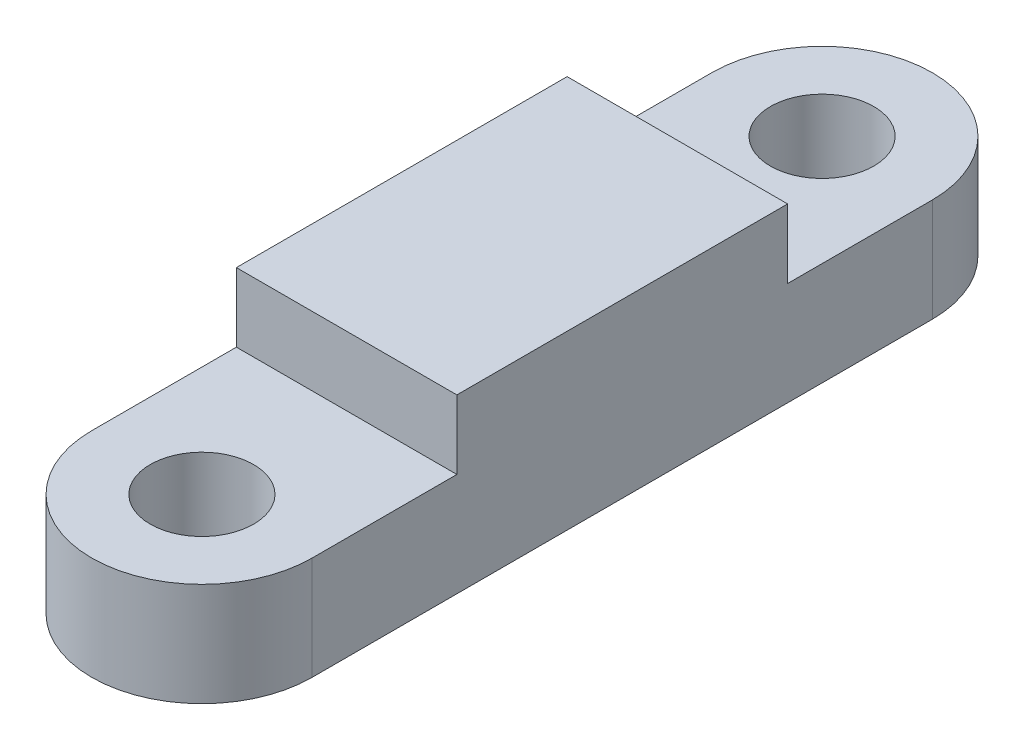
ISO-10303-21;
HEADER;
FILE_DESCRIPTION(('STEP AP214'),'2;1');
FILE_NAME('part.step','',(''),(''),'','','');
FILE_SCHEMA(('AUTOMOTIVE_DESIGN { 1 0 10303 214 1 1 1 1 }'));
ENDSEC;
DATA;
#1=APPLICATION_CONTEXT('core data for automotive mechanical design processes');
#2=APPLICATION_PROTOCOL_DEFINITION('international standard','automotive_design',2000,#1);
#3=PRODUCT_CONTEXT('',#1,'mechanical');
#4=PRODUCT('Part','Part','',(#3));
#5=PRODUCT_RELATED_PRODUCT_CATEGORY('part','',(#4));
#6=PRODUCT_DEFINITION_FORMATION('','',#4);
#7=PRODUCT_DEFINITION_CONTEXT('part definition',#1,'design');
#8=PRODUCT_DEFINITION('design','',#6,#7);
#9=PRODUCT_DEFINITION_SHAPE('','',#8);
#10=(LENGTH_UNIT() NAMED_UNIT(*) SI_UNIT(.MILLI.,.METRE.));
#11=(NAMED_UNIT(*) PLANE_ANGLE_UNIT() SI_UNIT($,.RADIAN.));
#12=(NAMED_UNIT(*) SI_UNIT($,.STERADIAN.) SOLID_ANGLE_UNIT());
#13=UNCERTAINTY_MEASURE_WITH_UNIT(LENGTH_MEASURE(1.E-05),#10,'distance_accuracy_value','');
#14=(GEOMETRIC_REPRESENTATION_CONTEXT(3) GLOBAL_UNCERTAINTY_ASSIGNED_CONTEXT((#13)) GLOBAL_UNIT_ASSIGNED_CONTEXT((#10,
#11,#12)) REPRESENTATION_CONTEXT('',''));
#15=CARTESIAN_POINT('',(0.,0.,0.));
#16=DIRECTION('',(0.,0.,1.));
#17=DIRECTION('',(1.,0.,0.));
#18=AXIS2_PLACEMENT_3D('',#15,#16,#17);
#19=CARTESIAN_POINT('',(0.,1.5,-9.));
#20=DIRECTION('',(0.,1.,0.));
#21=DIRECTION('',(0.,0.,1.));
#22=AXIS2_PLACEMENT_3D('',#19,#20,#21);
#23=PLANE('',#22);
#24=DIRECTION('',(-1.,0.,0.));
#25=VECTOR('',#24,1.);
#26=CARTESIAN_POINT('',(-1.6,1.5,-6.9));
#27=LINE('',#26,#25);
#28=CARTESIAN_POINT('',(1.6,1.5,-6.9));
#29=VERTEX_POINT('',#28);
#30=CARTESIAN_POINT('',(-1.6,1.5,-6.9));
#31=VERTEX_POINT('',#30);
#32=EDGE_CURVE('E50',#29,#31,#27,.T.);
#33=ORIENTED_EDGE('',*,*,#32,.F.);
#34=DIRECTION('',(0.,0.,-1.));
#35=VECTOR('',#34,1.);
#36=CARTESIAN_POINT('',(1.6,1.5,-9.));
#37=LINE('',#36,#35);
#38=CARTESIAN_POINT('',(1.6,1.5,-9.));
#39=VERTEX_POINT('',#38);
#40=EDGE_CURVE('E185',#29,#39,#37,.T.);
#41=ORIENTED_EDGE('',*,*,#40,.T.);
#42=CARTESIAN_POINT('',(0.,1.5,-9.));
#43=DIRECTION('',(0.,1.,0.));
#44=DIRECTION('',(0.,0.,1.));
#45=AXIS2_PLACEMENT_3D('',#42,#43,#44);
#46=CIRCLE('',#45,1.6);
#47=CARTESIAN_POINT('',(-1.6,1.5,-9.));
#48=VERTEX_POINT('',#47);
#49=EDGE_CURVE('E153',#39,#48,#46,.T.);
#50=ORIENTED_EDGE('',*,*,#49,.T.);
#51=DIRECTION('',(0.,0.,1.));
#52=VECTOR('',#51,1.);
#53=CARTESIAN_POINT('',(-1.6,1.5,-9.));
#54=LINE('',#53,#52);
#55=EDGE_CURVE('E165',#48,#31,#54,.T.);
#56=ORIENTED_EDGE('',*,*,#55,.T.);
#57=EDGE_LOOP('',(#33,#41,#50,#56));
#58=FACE_BOUND('',#57,.T.);
#59=CARTESIAN_POINT('',(0.,1.5,-9.));
#60=DIRECTION('',(0.,1.,0.));
#61=DIRECTION('',(0.,0.,1.));
#62=AXIS2_PLACEMENT_3D('',#59,#60,#61);
#63=CIRCLE('',#62,0.750000000000002);
#64=CARTESIAN_POINT('',(0.,1.5,-8.25));
#65=VERTEX_POINT('',#64);
#66=EDGE_CURVE('E147',#65,#65,#63,.T.);
#67=ORIENTED_EDGE('',*,*,#66,.F.);
#68=EDGE_LOOP('',(#67));
#69=FACE_BOUND('',#68,.T.);
#70=ADVANCED_FACE('F33',(#58,#69),#23,.T.);
#71=DIRECTION('',(1.,0.,0.));
#72=VECTOR('',#71,1.);
#73=CARTESIAN_POINT('',(-1.6,1.5,-2.1));
#74=LINE('',#73,#72);
#75=CARTESIAN_POINT('',(-1.6,1.5,-2.1));
#76=VERTEX_POINT('',#75);
#77=CARTESIAN_POINT('',(1.6,1.5,-2.1));
#78=VERTEX_POINT('',#77);
#79=EDGE_CURVE('E58',#76,#78,#74,.T.);
#80=ORIENTED_EDGE('',*,*,#79,.F.);
#81=CARTESIAN_POINT('',(-1.6,1.5,0.));
#82=VERTEX_POINT('',#81);
#83=EDGE_CURVE('E122',#76,#82,#54,.T.);
#84=ORIENTED_EDGE('',*,*,#83,.T.);
#85=CARTESIAN_POINT('',(0.,1.5,0.));
#86=DIRECTION('',(0.,1.,0.));
#87=DIRECTION('',(0.,0.,1.));
#88=AXIS2_PLACEMENT_3D('',#85,#86,#87);
#89=CIRCLE('',#88,1.6);
#90=CARTESIAN_POINT('',(1.6,1.5,0.));
#91=VERTEX_POINT('',#90);
#92=EDGE_CURVE('E159',#82,#91,#89,.T.);
#93=ORIENTED_EDGE('',*,*,#92,.T.);
#94=EDGE_CURVE('E175',#91,#78,#37,.T.);
#95=ORIENTED_EDGE('',*,*,#94,.T.);
#96=EDGE_LOOP('',(#80,#84,#93,#95));
#97=FACE_BOUND('',#96,.T.);
#98=CARTESIAN_POINT('',(0.,1.5,0.));
#99=DIRECTION('',(0.,1.,0.));
#100=DIRECTION('',(0.,0.,1.));
#101=AXIS2_PLACEMENT_3D('',#98,#99,#100);
#102=CIRCLE('',#101,0.750000000000002);
#103=CARTESIAN_POINT('',(0.,1.5,0.750000000000002));
#104=VERTEX_POINT('',#103);
#105=EDGE_CURVE('E126',#104,#104,#102,.T.);
#106=ORIENTED_EDGE('',*,*,#105,.F.);
#107=EDGE_LOOP('',(#106));
#108=FACE_BOUND('',#107,.T.);
#109=ADVANCED_FACE('F191',(#97,#108),#23,.T.);
#110=CARTESIAN_POINT('',(0.,0.,-9.));
#111=DIRECTION('',(0.,1.,0.));
#112=DIRECTION('',(0.,0.,1.));
#113=AXIS2_PLACEMENT_3D('',#110,#111,#112);
#114=PLANE('',#113);
#115=CARTESIAN_POINT('',(0.,0.,-9.));
#116=DIRECTION('',(0.,1.,0.));
#117=DIRECTION('',(0.,0.,1.));
#118=AXIS2_PLACEMENT_3D('',#115,#116,#117);
#119=CIRCLE('',#118,0.750000000000002);
#120=CARTESIAN_POINT('',(0.,0.,-8.25));
#121=VERTEX_POINT('',#120);
#122=EDGE_CURVE('E145',#121,#121,#119,.T.);
#123=ORIENTED_EDGE('',*,*,#122,.T.);
#124=EDGE_LOOP('',(#123));
#125=FACE_BOUND('',#124,.T.);
#126=CARTESIAN_POINT('',(0.,0.,-9.));
#127=DIRECTION('',(0.,1.,0.));
#128=DIRECTION('',(0.,0.,1.));
#129=AXIS2_PLACEMENT_3D('',#126,#127,#128);
#130=CIRCLE('',#129,1.6);
#131=CARTESIAN_POINT('',(1.6,0.,-9.));
#132=VERTEX_POINT('',#131);
#133=CARTESIAN_POINT('',(-1.6,0.,-9.));
#134=VERTEX_POINT('',#133);
#135=EDGE_CURVE('E150',#132,#134,#130,.T.);
#136=ORIENTED_EDGE('',*,*,#135,.F.);
#137=DIRECTION('',(0.,0.,-1.));
#138=VECTOR('',#137,1.);
#139=CARTESIAN_POINT('',(1.6,0.,-9.));
#140=LINE('',#139,#138);
#141=CARTESIAN_POINT('',(1.6,0.,0.));
#142=VERTEX_POINT('',#141);
#143=EDGE_CURVE('E156',#142,#132,#140,.T.);
#144=ORIENTED_EDGE('',*,*,#143,.F.);
#145=CARTESIAN_POINT('',(0.,0.,0.));
#146=DIRECTION('',(0.,1.,0.));
#147=DIRECTION('',(0.,0.,1.));
#148=AXIS2_PLACEMENT_3D('',#145,#146,#147);
#149=CIRCLE('',#148,1.6);
#150=CARTESIAN_POINT('',(-1.6,0.,0.));
#151=VERTEX_POINT('',#150);
#152=EDGE_CURVE('E177',#151,#142,#149,.T.);
#153=ORIENTED_EDGE('',*,*,#152,.F.);
#154=DIRECTION('',(0.,0.,1.));
#155=VECTOR('',#154,1.);
#156=CARTESIAN_POINT('',(-1.6,0.,-9.));
#157=LINE('',#156,#155);
#158=EDGE_CURVE('E179',#134,#151,#157,.T.);
#159=ORIENTED_EDGE('',*,*,#158,.F.);
#160=EDGE_LOOP('',(#136,#144,#153,#159));
#161=FACE_BOUND('',#160,.T.);
#162=CARTESIAN_POINT('',(0.,0.,0.));
#163=DIRECTION('',(0.,1.,0.));
#164=DIRECTION('',(0.,0.,1.));
#165=AXIS2_PLACEMENT_3D('',#162,#163,#164);
#166=CIRCLE('',#165,0.750000000000002);
#167=CARTESIAN_POINT('',(0.,0.,0.750000000000002));
#168=VERTEX_POINT('',#167);
#169=EDGE_CURVE('E123',#168,#168,#166,.T.);
#170=ORIENTED_EDGE('',*,*,#169,.T.);
#171=EDGE_LOOP('',(#170));
#172=FACE_BOUND('',#171,.T.);
#173=ADVANCED_FACE('F219',(#125,#161,#172),#114,.F.);
#174=CARTESIAN_POINT('',(0.,1.5,-9.));
#175=DIRECTION('',(0.,-1.,0.));
#176=DIRECTION('',(0.,0.,-1.));
#177=AXIS2_PLACEMENT_3D('',#174,#175,#176);
#178=CYLINDRICAL_SURFACE('',#177,1.6);
#179=ORIENTED_EDGE('',*,*,#135,.T.);
#180=DIRECTION('',(0.,-1.,0.));
#181=VECTOR('',#180,1.);
#182=CARTESIAN_POINT('',(-1.6,1.5,-9.));
#183=LINE('',#182,#181);
#184=EDGE_CURVE('E11',#48,#134,#183,.T.);
#185=ORIENTED_EDGE('',*,*,#184,.F.);
#186=ORIENTED_EDGE('',*,*,#49,.F.);
#187=DIRECTION('',(0.,-1.,0.));
#188=VECTOR('',#187,1.);
#189=CARTESIAN_POINT('',(1.6,1.5,-9.));
#190=LINE('',#189,#188);
#191=EDGE_CURVE('E172',#39,#132,#190,.T.);
#192=ORIENTED_EDGE('',*,*,#191,.T.);
#193=EDGE_LOOP('',(#179,#185,#186,#192));
#194=FACE_BOUND('',#193,.T.);
#195=ADVANCED_FACE('F35',(#194),#178,.T.);
#196=CARTESIAN_POINT('',(-1.6,1.5,-9.));
#197=DIRECTION('',(1.,0.,0.));
#198=DIRECTION('',(0.,0.,-1.));
#199=AXIS2_PLACEMENT_3D('',#196,#197,#198);
#200=PLANE('',#199);
#201=ORIENTED_EDGE('',*,*,#158,.T.);
#202=DIRECTION('',(0.,-1.,0.));
#203=VECTOR('',#202,1.);
#204=CARTESIAN_POINT('',(-1.6,1.5,0.));
#205=LINE('',#204,#203);
#206=EDGE_CURVE('E42',#82,#151,#205,.T.);
#207=ORIENTED_EDGE('',*,*,#206,.F.);
#208=ORIENTED_EDGE('',*,*,#83,.F.);
#209=DIRECTION('',(0.,-1.,0.));
#210=VECTOR('',#209,1.);
#211=CARTESIAN_POINT('',(-1.6,2.5,-2.1));
#212=LINE('',#211,#210);
#213=CARTESIAN_POINT('',(-1.6,2.5,-2.1));
#214=VERTEX_POINT('',#213);
#215=EDGE_CURVE('E104',#214,#76,#212,.T.);
#216=ORIENTED_EDGE('',*,*,#215,.F.);
#217=DIRECTION('',(0.,0.,1.));
#218=VECTOR('',#217,1.);
#219=CARTESIAN_POINT('',(-1.6,2.5,-6.9));
#220=LINE('',#219,#218);
#221=CARTESIAN_POINT('',(-1.6,2.5,-6.9));
#222=VERTEX_POINT('',#221);
#223=EDGE_CURVE('E110',#222,#214,#220,.T.);
#224=ORIENTED_EDGE('',*,*,#223,.F.);
#225=DIRECTION('',(0.,-1.,0.));
#226=VECTOR('',#225,1.);
#227=CARTESIAN_POINT('',(-1.6,2.5,-6.9));
#228=LINE('',#227,#226);
#229=EDGE_CURVE('E137',#222,#31,#228,.T.);
#230=ORIENTED_EDGE('',*,*,#229,.T.);
#231=ORIENTED_EDGE('',*,*,#55,.F.);
#232=ORIENTED_EDGE('',*,*,#184,.T.);
#233=EDGE_LOOP('',(#201,#207,#208,#216,#224,#230,#231,#232));
#234=FACE_BOUND('',#233,.T.);
#235=ADVANCED_FACE('F120',(#234),#200,.F.);
#236=CARTESIAN_POINT('',(0.,1.5,0.));
#237=DIRECTION('',(0.,-1.,0.));
#238=DIRECTION('',(0.,0.,-1.));
#239=AXIS2_PLACEMENT_3D('',#236,#237,#238);
#240=CYLINDRICAL_SURFACE('',#239,1.6);
#241=ORIENTED_EDGE('',*,*,#152,.T.);
#242=DIRECTION('',(0.,-1.,0.));
#243=VECTOR('',#242,1.);
#244=CARTESIAN_POINT('',(1.6,1.5,0.));
#245=LINE('',#244,#243);
#246=EDGE_CURVE('E169',#91,#142,#245,.T.);
#247=ORIENTED_EDGE('',*,*,#246,.F.);
#248=ORIENTED_EDGE('',*,*,#92,.F.);
#249=ORIENTED_EDGE('',*,*,#206,.T.);
#250=EDGE_LOOP('',(#241,#247,#248,#249));
#251=FACE_BOUND('',#250,.T.);
#252=ADVANCED_FACE('F194',(#251),#240,.T.);
#253=CARTESIAN_POINT('',(1.6,1.5,-9.));
#254=DIRECTION('',(-1.,0.,0.));
#255=DIRECTION('',(0.,0.,1.));
#256=AXIS2_PLACEMENT_3D('',#253,#254,#255);
#257=PLANE('',#256);
#258=ORIENTED_EDGE('',*,*,#143,.T.);
#259=ORIENTED_EDGE('',*,*,#191,.F.);
#260=ORIENTED_EDGE('',*,*,#40,.F.);
#261=DIRECTION('',(0.,-1.,0.));
#262=VECTOR('',#261,1.);
#263=CARTESIAN_POINT('',(1.6,2.5,-6.9));
#264=LINE('',#263,#262);
#265=CARTESIAN_POINT('',(1.6,2.5,-6.9));
#266=VERTEX_POINT('',#265);
#267=EDGE_CURVE('E128',#266,#29,#264,.T.);
#268=ORIENTED_EDGE('',*,*,#267,.F.);
#269=DIRECTION('',(0.,0.,-1.));
#270=VECTOR('',#269,1.);
#271=CARTESIAN_POINT('',(1.6,2.5,-6.9));
#272=LINE('',#271,#270);
#273=CARTESIAN_POINT('',(1.6,2.5,-2.1));
#274=VERTEX_POINT('',#273);
#275=EDGE_CURVE('E109',#274,#266,#272,.T.);
#276=ORIENTED_EDGE('',*,*,#275,.F.);
#277=DIRECTION('',(0.,-1.,0.));
#278=VECTOR('',#277,1.);
#279=CARTESIAN_POINT('',(1.6,2.5,-2.1));
#280=LINE('',#279,#278);
#281=EDGE_CURVE('E106',#274,#78,#280,.T.);
#282=ORIENTED_EDGE('',*,*,#281,.T.);
#283=ORIENTED_EDGE('',*,*,#94,.F.);
#284=ORIENTED_EDGE('',*,*,#246,.T.);
#285=EDGE_LOOP('',(#258,#259,#260,#268,#276,#282,#283,#284));
#286=FACE_BOUND('',#285,.T.);
#287=ADVANCED_FACE('F198',(#286),#257,.F.);
#288=CARTESIAN_POINT('',(0.,1.5,-9.));
#289=DIRECTION('',(0.,-1.,0.));
#290=DIRECTION('',(0.,0.,-1.));
#291=AXIS2_PLACEMENT_3D('',#288,#289,#290);
#292=CYLINDRICAL_SURFACE('',#291,0.750000000000002);
#293=ORIENTED_EDGE('',*,*,#66,.T.);
#294=EDGE_LOOP('',(#293));
#295=FACE_BOUND('',#294,.T.);
#296=ORIENTED_EDGE('',*,*,#122,.F.);
#297=EDGE_LOOP('',(#296));
#298=FACE_BOUND('',#297,.T.);
#299=ADVANCED_FACE('F223',(#295,#298),#292,.F.);
#300=CARTESIAN_POINT('',(0.,1.5,0.));
#301=DIRECTION('',(0.,-1.,0.));
#302=DIRECTION('',(0.,0.,-1.));
#303=AXIS2_PLACEMENT_3D('',#300,#301,#302);
#304=CYLINDRICAL_SURFACE('',#303,0.750000000000002);
#305=ORIENTED_EDGE('',*,*,#105,.T.);
#306=EDGE_LOOP('',(#305));
#307=FACE_BOUND('',#306,.T.);
#308=ORIENTED_EDGE('',*,*,#169,.F.);
#309=EDGE_LOOP('',(#308));
#310=FACE_BOUND('',#309,.T.);
#311=ADVANCED_FACE('F212',(#307,#310),#304,.F.);
#312=CARTESIAN_POINT('',(-1.6,2.5,-2.1));
#313=DIRECTION('',(0.,0.,-1.));
#314=DIRECTION('',(-1.,0.,0.));
#315=AXIS2_PLACEMENT_3D('',#312,#313,#314);
#316=PLANE('',#315);
#317=ORIENTED_EDGE('',*,*,#79,.T.);
#318=ORIENTED_EDGE('',*,*,#281,.F.);
#319=DIRECTION('',(1.,0.,0.));
#320=VECTOR('',#319,1.);
#321=CARTESIAN_POINT('',(-1.6,2.5,-2.1));
#322=LINE('',#321,#320);
#323=EDGE_CURVE('E100',#214,#274,#322,.T.);
#324=ORIENTED_EDGE('',*,*,#323,.F.);
#325=ORIENTED_EDGE('',*,*,#215,.T.);
#326=EDGE_LOOP('',(#317,#318,#324,#325));
#327=FACE_BOUND('',#326,.T.);
#328=ADVANCED_FACE('F102',(#327),#316,.F.);
#329=CARTESIAN_POINT('',(-1.6,2.5,-6.9));
#330=DIRECTION('',(0.,0.,1.));
#331=DIRECTION('',(1.,0.,0.));
#332=AXIS2_PLACEMENT_3D('',#329,#330,#331);
#333=PLANE('',#332);
#334=ORIENTED_EDGE('',*,*,#32,.T.);
#335=ORIENTED_EDGE('',*,*,#229,.F.);
#336=DIRECTION('',(-1.,0.,0.));
#337=VECTOR('',#336,1.);
#338=CARTESIAN_POINT('',(-1.6,2.5,-6.9));
#339=LINE('',#338,#337);
#340=EDGE_CURVE('E115',#266,#222,#339,.T.);
#341=ORIENTED_EDGE('',*,*,#340,.F.);
#342=ORIENTED_EDGE('',*,*,#267,.T.);
#343=EDGE_LOOP('',(#334,#335,#341,#342));
#344=FACE_BOUND('',#343,.T.);
#345=ADVANCED_FACE('F204',(#344),#333,.F.);
#346=CARTESIAN_POINT('',(0.,2.5,0.));
#347=DIRECTION('',(0.,1.,0.));
#348=DIRECTION('',(0.,0.,1.));
#349=AXIS2_PLACEMENT_3D('',#346,#347,#348);
#350=PLANE('',#349);
#351=ORIENTED_EDGE('',*,*,#223,.T.);
#352=ORIENTED_EDGE('',*,*,#323,.T.);
#353=ORIENTED_EDGE('',*,*,#275,.T.);
#354=ORIENTED_EDGE('',*,*,#340,.T.);
#355=EDGE_LOOP('',(#351,#352,#353,#354));
#356=FACE_BOUND('',#355,.T.);
#357=ADVANCED_FACE('F113',(#356),#350,.T.);
#358=CLOSED_SHELL('',(#70,#109,#173,#195,#235,#252,#287,#299,#311,#328,#345,#357));
#359=MANIFOLD_SOLID_BREP('B2',#358);
#360=ADVANCED_BREP_SHAPE_REPRESENTATION('',(#18,#359),#14);
#361=SHAPE_DEFINITION_REPRESENTATION(#9,#360);
ENDSEC;
END-ISO-10303-21;
